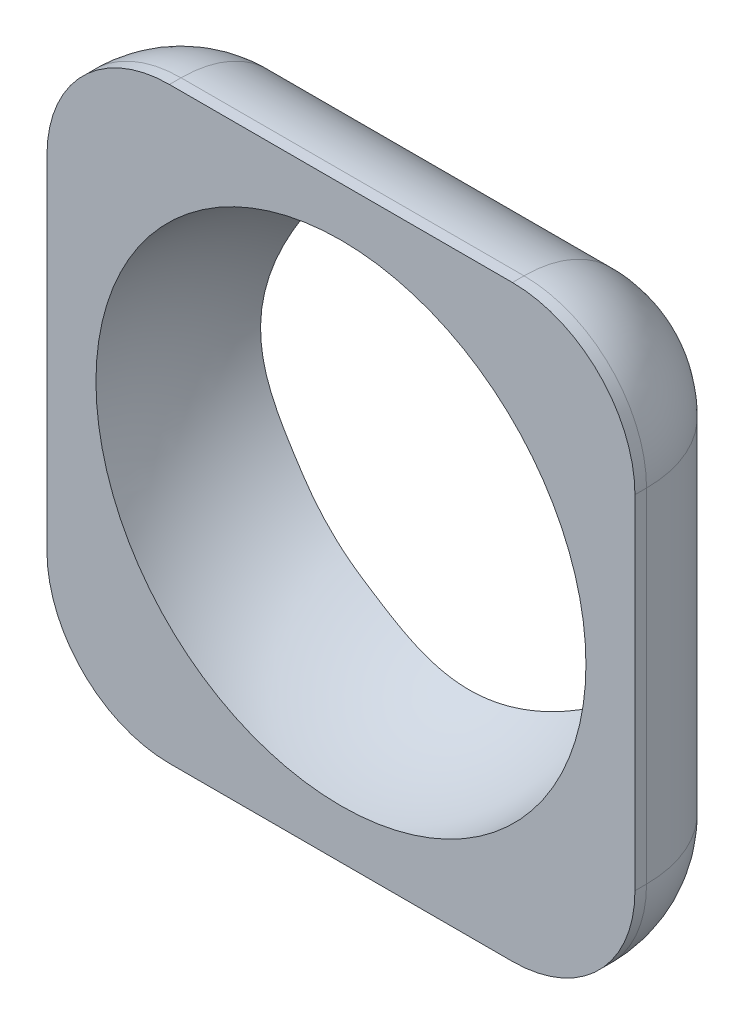
ISO-10303-21;
HEADER;
FILE_DESCRIPTION(('STEP AP214'),'2;1');
FILE_NAME('part.step','',(''),(''),'','','');
FILE_SCHEMA(('AUTOMOTIVE_DESIGN { 1 0 10303 214 1 1 1 1 }'));
ENDSEC;
DATA;
#1=APPLICATION_CONTEXT('core data for automotive mechanical design processes');
#2=APPLICATION_PROTOCOL_DEFINITION('international standard','automotive_design',2000,#1);
#3=PRODUCT_CONTEXT('',#1,'mechanical');
#4=PRODUCT('Part','Part','',(#3));
#5=PRODUCT_RELATED_PRODUCT_CATEGORY('part','',(#4));
#6=PRODUCT_DEFINITION_FORMATION('','',#4);
#7=PRODUCT_DEFINITION_CONTEXT('part definition',#1,'design');
#8=PRODUCT_DEFINITION('design','',#6,#7);
#9=PRODUCT_DEFINITION_SHAPE('','',#8);
#10=(LENGTH_UNIT() NAMED_UNIT(*) SI_UNIT(.MILLI.,.METRE.));
#11=(NAMED_UNIT(*) PLANE_ANGLE_UNIT() SI_UNIT($,.RADIAN.));
#12=(NAMED_UNIT(*) SI_UNIT($,.STERADIAN.) SOLID_ANGLE_UNIT());
#13=UNCERTAINTY_MEASURE_WITH_UNIT(LENGTH_MEASURE(1.E-05),#10,'distance_accuracy_value','');
#14=(GEOMETRIC_REPRESENTATION_CONTEXT(3) GLOBAL_UNCERTAINTY_ASSIGNED_CONTEXT((#13)) GLOBAL_UNIT_ASSIGNED_CONTEXT((#10,
#11,#12)) REPRESENTATION_CONTEXT('',''));
#15=CARTESIAN_POINT('',(0.,0.,0.));
#16=DIRECTION('',(0.,0.,1.));
#17=DIRECTION('',(1.,0.,0.));
#18=AXIS2_PLACEMENT_3D('',#15,#16,#17);
#19=CARTESIAN_POINT('',(0.,24.,5.02661661329301));
#20=DIRECTION('',(0.,0.,1.));
#21=DIRECTION('',(1.,0.,0.));
#22=AXIS2_PLACEMENT_3D('',#19,#20,#21);
#23=PLANE('',#22);
#24=DIRECTION('',(0.,-1.,0.));
#25=VECTOR('',#24,1.);
#26=CARTESIAN_POINT('',(19.,24.,5.02661661329301));
#27=LINE('',#26,#25);
#28=CARTESIAN_POINT('',(19.,7.41283591942474,5.02661661329301));
#29=VERTEX_POINT('',#28);
#30=CARTESIAN_POINT('',(19.,5.,5.02661661329301));
#31=VERTEX_POINT('',#30);
#32=EDGE_CURVE('E172',#29,#31,#27,.T.);
#33=ORIENTED_EDGE('',*,*,#32,.T.);
#34=DIRECTION('',(1.,0.,0.));
#35=VECTOR('',#34,1.);
#36=CARTESIAN_POINT('',(0.,5.,5.02661661329301));
#37=LINE('',#36,#35);
#38=CARTESIAN_POINT('',(16.5871640805753,5.,5.02661661329301));
#39=VERTEX_POINT('',#38);
#40=EDGE_CURVE('E174',#31,#39,#37,.F.);
#41=ORIENTED_EDGE('',*,*,#40,.T.);
#42=CARTESIAN_POINT('',(12.,12.,5.02661661329301));
#43=DIRECTION('',(0.,0.,1.));
#44=DIRECTION('',(1.,0.,0.));
#45=AXIS2_PLACEMENT_3D('',#42,#43,#44);
#46=CIRCLE('',#45,8.36911430810452);
#47=EDGE_CURVE('E262',#29,#39,#46,.F.);
#48=ORIENTED_EDGE('',*,*,#47,.F.);
#49=EDGE_LOOP('',(#33,#41,#48));
#50=FACE_BOUND('',#49,.T.);
#51=ADVANCED_FACE('F32',(#50),#23,.F.);
#52=DIRECTION('',(1.,0.,0.));
#53=VECTOR('',#52,1.);
#54=CARTESIAN_POINT('',(0.,19.,5.02661661329301));
#55=LINE('',#54,#53);
#56=CARTESIAN_POINT('',(16.5871640805753,19.,5.02661661329301));
#57=VERTEX_POINT('',#56);
#58=CARTESIAN_POINT('',(19.,19.,5.02661661329301));
#59=VERTEX_POINT('',#58);
#60=EDGE_CURVE('E168',#57,#59,#55,.T.);
#61=ORIENTED_EDGE('',*,*,#60,.T.);
#62=DIRECTION('',(0.,-1.,0.));
#63=VECTOR('',#62,1.);
#64=CARTESIAN_POINT('',(19.,24.,5.02661661329301));
#65=LINE('',#64,#63);
#66=CARTESIAN_POINT('',(19.,16.5871640805753,5.02661661329301));
#67=VERTEX_POINT('',#66);
#68=EDGE_CURVE('E170',#59,#67,#65,.T.);
#69=ORIENTED_EDGE('',*,*,#68,.T.);
#70=EDGE_CURVE('E302',#57,#67,#46,.F.);
#71=ORIENTED_EDGE('',*,*,#70,.F.);
#72=EDGE_LOOP('',(#61,#69,#71));
#73=FACE_BOUND('',#72,.T.);
#74=ADVANCED_FACE('F235',(#73),#23,.F.);
#75=CARTESIAN_POINT('',(7.41283591942474,5.,5.02661661329301));
#76=VERTEX_POINT('',#75);
#77=CARTESIAN_POINT('',(5.,7.41283591942474,5.02661661329301));
#78=VERTEX_POINT('',#77);
#79=EDGE_CURVE('E258',#76,#78,#46,.F.);
#80=ORIENTED_EDGE('',*,*,#79,.F.);
#81=DIRECTION('',(1.,0.,0.));
#82=VECTOR('',#81,1.);
#83=CARTESIAN_POINT('',(0.,5.,5.02661661329301));
#84=LINE('',#83,#82);
#85=CARTESIAN_POINT('',(5.,5.,5.02661661329301));
#86=VERTEX_POINT('',#85);
#87=EDGE_CURVE('E166',#76,#86,#84,.F.);
#88=ORIENTED_EDGE('',*,*,#87,.T.);
#89=DIRECTION('',(0.,-1.,0.));
#90=VECTOR('',#89,1.);
#91=CARTESIAN_POINT('',(5.,24.,5.02661661329301));
#92=LINE('',#91,#90);
#93=EDGE_CURVE('E164',#86,#78,#92,.F.);
#94=ORIENTED_EDGE('',*,*,#93,.T.);
#95=EDGE_LOOP('',(#80,#88,#94));
#96=FACE_BOUND('',#95,.T.);
#97=ADVANCED_FACE('F240',(#96),#23,.F.);
#98=CARTESIAN_POINT('',(0.,0.,10.5));
#99=DIRECTION('',(1.,0.,0.));
#100=DIRECTION('',(0.,0.,-1.));
#101=AXIS2_PLACEMENT_3D('',#98,#99,#100);
#102=PLANE('',#101);
#103=DIRECTION('',(0.,-1.,0.));
#104=VECTOR('',#103,1.);
#105=CARTESIAN_POINT('',(0.,0.,10.026616613293));
#106=LINE('',#105,#104);
#107=CARTESIAN_POINT('',(0.,19.,10.026616613293));
#108=VERTEX_POINT('',#107);
#109=CARTESIAN_POINT('',(0.,5.,10.026616613293));
#110=VERTEX_POINT('',#109);
#111=EDGE_CURVE('E49',#108,#110,#106,.T.);
#112=ORIENTED_EDGE('',*,*,#111,.T.);
#113=DIRECTION('',(0.,0.,-1.));
#114=VECTOR('',#113,1.);
#115=CARTESIAN_POINT('',(0.,5.,10.5));
#116=LINE('',#115,#114);
#117=CARTESIAN_POINT('',(0.,5.,10.5));
#118=VERTEX_POINT('',#117);
#119=EDGE_CURVE('E336',#110,#118,#116,.F.);
#120=ORIENTED_EDGE('',*,*,#119,.T.);
#121=DIRECTION('',(0.,-1.,0.));
#122=VECTOR('',#121,1.);
#123=CARTESIAN_POINT('',(0.,0.,10.5));
#124=LINE('',#123,#122);
#125=CARTESIAN_POINT('',(0.,19.,10.5));
#126=VERTEX_POINT('',#125);
#127=EDGE_CURVE('E139',#126,#118,#124,.T.);
#128=ORIENTED_EDGE('',*,*,#127,.F.);
#129=DIRECTION('',(0.,0.,-1.));
#130=VECTOR('',#129,1.);
#131=CARTESIAN_POINT('',(0.,19.,10.5));
#132=LINE('',#131,#130);
#133=EDGE_CURVE('E54',#126,#108,#132,.T.);
#134=ORIENTED_EDGE('',*,*,#133,.T.);
#135=EDGE_LOOP('',(#112,#120,#128,#134));
#136=FACE_BOUND('',#135,.T.);
#137=ADVANCED_FACE('F250',(#136),#102,.F.);
#138=CARTESIAN_POINT('',(0.,0.,10.5));
#139=DIRECTION('',(0.,1.,0.));
#140=DIRECTION('',(0.,0.,1.));
#141=AXIS2_PLACEMENT_3D('',#138,#139,#140);
#142=PLANE('',#141);
#143=DIRECTION('',(1.,0.,0.));
#144=VECTOR('',#143,1.);
#145=CARTESIAN_POINT('',(0.,0.,10.5));
#146=LINE('',#145,#144);
#147=CARTESIAN_POINT('',(5.,0.,10.5));
#148=VERTEX_POINT('',#147);
#149=CARTESIAN_POINT('',(19.,0.,10.5));
#150=VERTEX_POINT('',#149);
#151=EDGE_CURVE('E137',#148,#150,#146,.T.);
#152=ORIENTED_EDGE('',*,*,#151,.F.);
#153=DIRECTION('',(0.,0.,-1.));
#154=VECTOR('',#153,1.);
#155=CARTESIAN_POINT('',(5.,0.,10.5));
#156=LINE('',#155,#154);
#157=CARTESIAN_POINT('',(5.,0.,10.026616613293));
#158=VERTEX_POINT('',#157);
#159=EDGE_CURVE('E145',#148,#158,#156,.T.);
#160=ORIENTED_EDGE('',*,*,#159,.T.);
#161=DIRECTION('',(1.,0.,0.));
#162=VECTOR('',#161,1.);
#163=CARTESIAN_POINT('',(0.,0.,10.026616613293));
#164=LINE('',#163,#162);
#165=CARTESIAN_POINT('',(19.,0.,10.026616613293));
#166=VERTEX_POINT('',#165);
#167=EDGE_CURVE('E156',#158,#166,#164,.T.);
#168=ORIENTED_EDGE('',*,*,#167,.T.);
#169=DIRECTION('',(0.,0.,-1.));
#170=VECTOR('',#169,1.);
#171=CARTESIAN_POINT('',(19.,0.,10.5));
#172=LINE('',#171,#170);
#173=EDGE_CURVE('E148',#166,#150,#172,.F.);
#174=ORIENTED_EDGE('',*,*,#173,.T.);
#175=EDGE_LOOP('',(#152,#160,#168,#174));
#176=FACE_BOUND('',#175,.T.);
#177=ADVANCED_FACE('F143',(#176),#142,.F.);
#178=CARTESIAN_POINT('',(24.,0.,10.5));
#179=DIRECTION('',(-1.,0.,0.));
#180=DIRECTION('',(0.,0.,1.));
#181=AXIS2_PLACEMENT_3D('',#178,#179,#180);
#182=PLANE('',#181);
#183=DIRECTION('',(0.,-1.,0.));
#184=VECTOR('',#183,1.);
#185=CARTESIAN_POINT('',(24.,0.,10.026616613293));
#186=LINE('',#185,#184);
#187=CARTESIAN_POINT('',(24.,5.,10.026616613293));
#188=VERTEX_POINT('',#187);
#189=CARTESIAN_POINT('',(24.,19.,10.026616613293));
#190=VERTEX_POINT('',#189);
#191=EDGE_CURVE('E348',#188,#190,#186,.F.);
#192=ORIENTED_EDGE('',*,*,#191,.T.);
#193=DIRECTION('',(0.,0.,-1.));
#194=VECTOR('',#193,1.);
#195=CARTESIAN_POINT('',(24.,19.,10.5));
#196=LINE('',#195,#194);
#197=CARTESIAN_POINT('',(24.,19.,10.5));
#198=VERTEX_POINT('',#197);
#199=EDGE_CURVE('E332',#190,#198,#196,.F.);
#200=ORIENTED_EDGE('',*,*,#199,.T.);
#201=DIRECTION('',(0.,1.,0.));
#202=VECTOR('',#201,1.);
#203=CARTESIAN_POINT('',(24.,0.,10.5));
#204=LINE('',#203,#202);
#205=CARTESIAN_POINT('',(24.,5.,10.5));
#206=VERTEX_POINT('',#205);
#207=EDGE_CURVE('E149',#206,#198,#204,.T.);
#208=ORIENTED_EDGE('',*,*,#207,.F.);
#209=DIRECTION('',(0.,0.,-1.));
#210=VECTOR('',#209,1.);
#211=CARTESIAN_POINT('',(24.,5.,10.5));
#212=LINE('',#211,#210);
#213=EDGE_CURVE('E349',#206,#188,#212,.T.);
#214=ORIENTED_EDGE('',*,*,#213,.T.);
#215=EDGE_LOOP('',(#192,#200,#208,#214));
#216=FACE_BOUND('',#215,.T.);
#217=ADVANCED_FACE('F352',(#216),#182,.F.);
#218=CARTESIAN_POINT('',(0.,24.,10.5));
#219=DIRECTION('',(0.,-1.,0.));
#220=DIRECTION('',(0.,0.,-1.));
#221=AXIS2_PLACEMENT_3D('',#218,#219,#220);
#222=PLANE('',#221);
#223=DIRECTION('',(1.,0.,0.));
#224=VECTOR('',#223,1.);
#225=CARTESIAN_POINT('',(0.,24.,10.026616613293));
#226=LINE('',#225,#224);
#227=CARTESIAN_POINT('',(19.,24.,10.026616613293));
#228=VERTEX_POINT('',#227);
#229=CARTESIAN_POINT('',(5.,24.,10.026616613293));
#230=VERTEX_POINT('',#229);
#231=EDGE_CURVE('E344',#228,#230,#226,.F.);
#232=ORIENTED_EDGE('',*,*,#231,.T.);
#233=DIRECTION('',(0.,0.,-1.));
#234=VECTOR('',#233,1.);
#235=CARTESIAN_POINT('',(5.,24.,10.5));
#236=LINE('',#235,#234);
#237=CARTESIAN_POINT('',(5.,24.,10.5));
#238=VERTEX_POINT('',#237);
#239=EDGE_CURVE('E342',#230,#238,#236,.F.);
#240=ORIENTED_EDGE('',*,*,#239,.T.);
#241=DIRECTION('',(-1.,0.,0.));
#242=VECTOR('',#241,1.);
#243=CARTESIAN_POINT('',(0.,24.,10.5));
#244=LINE('',#243,#242);
#245=CARTESIAN_POINT('',(19.,24.,10.5));
#246=VERTEX_POINT('',#245);
#247=EDGE_CURVE('E317',#246,#238,#244,.T.);
#248=ORIENTED_EDGE('',*,*,#247,.F.);
#249=DIRECTION('',(0.,0.,-1.));
#250=VECTOR('',#249,1.);
#251=CARTESIAN_POINT('',(19.,24.,10.5));
#252=LINE('',#251,#250);
#253=EDGE_CURVE('E333',#246,#228,#252,.T.);
#254=ORIENTED_EDGE('',*,*,#253,.T.);
#255=EDGE_LOOP('',(#232,#240,#248,#254));
#256=FACE_BOUND('',#255,.T.);
#257=ADVANCED_FACE('F445',(#256),#222,.F.);
#258=CARTESIAN_POINT('',(0.,0.,10.5));
#259=DIRECTION('',(0.,0.,-1.));
#260=DIRECTION('',(-1.,0.,0.));
#261=AXIS2_PLACEMENT_3D('',#258,#259,#260);
#262=PLANE('',#261);
#263=CARTESIAN_POINT('',(12.,12.,10.5));
#264=DIRECTION('',(0.,0.,-1.));
#265=DIRECTION('',(-1.,0.,0.));
#266=AXIS2_PLACEMENT_3D('',#263,#264,#265);
#267=CIRCLE('',#266,10.);
#268=CARTESIAN_POINT('',(2.,12.,10.5));
#269=VERTEX_POINT('',#268);
#270=EDGE_CURVE('E310',#269,#269,#267,.T.);
#271=ORIENTED_EDGE('',*,*,#270,.T.);
#272=EDGE_LOOP('',(#271));
#273=FACE_BOUND('',#272,.T.);
#274=ORIENTED_EDGE('',*,*,#127,.T.);
#275=CARTESIAN_POINT('',(5.,5.,10.5));
#276=DIRECTION('',(0.,0.,-1.));
#277=DIRECTION('',(-1.,0.,0.));
#278=AXIS2_PLACEMENT_3D('',#275,#276,#277);
#279=CIRCLE('',#278,5.);
#280=EDGE_CURVE('E11',#118,#148,#279,.F.);
#281=ORIENTED_EDGE('',*,*,#280,.T.);
#282=ORIENTED_EDGE('',*,*,#151,.T.);
#283=CARTESIAN_POINT('',(19.,5.,10.5));
#284=DIRECTION('',(0.,0.,-1.));
#285=DIRECTION('',(-1.,0.,0.));
#286=AXIS2_PLACEMENT_3D('',#283,#284,#285);
#287=CIRCLE('',#286,5.);
#288=EDGE_CURVE('E325',#150,#206,#287,.F.);
#289=ORIENTED_EDGE('',*,*,#288,.T.);
#290=ORIENTED_EDGE('',*,*,#207,.T.);
#291=CARTESIAN_POINT('',(19.,19.,10.5));
#292=DIRECTION('',(0.,0.,-1.));
#293=DIRECTION('',(-1.,0.,0.));
#294=AXIS2_PLACEMENT_3D('',#291,#292,#293);
#295=CIRCLE('',#294,5.);
#296=EDGE_CURVE('E323',#198,#246,#295,.F.);
#297=ORIENTED_EDGE('',*,*,#296,.T.);
#298=ORIENTED_EDGE('',*,*,#247,.T.);
#299=CARTESIAN_POINT('',(5.,19.,10.5));
#300=DIRECTION('',(0.,0.,-1.));
#301=DIRECTION('',(-1.,0.,0.));
#302=AXIS2_PLACEMENT_3D('',#299,#300,#301);
#303=CIRCLE('',#302,5.);
#304=EDGE_CURVE('E41',#238,#126,#303,.F.);
#305=ORIENTED_EDGE('',*,*,#304,.T.);
#306=EDGE_LOOP('',(#274,#281,#282,#289,#290,#297,#298,#305));
#307=FACE_BOUND('',#306,.T.);
#308=ADVANCED_FACE('F136',(#273,#307),#262,.F.);
#309=CARTESIAN_POINT('',(12.,12.,10.5));
#310=DIRECTION('',(0.,1.,0.));
#311=DIRECTION('',(1.,0.,0.));
#312=AXIS2_PLACEMENT_3D('',#309,#310,#311);
#313=SPHERICAL_SURFACE('',#312,10.);
#314=ORIENTED_EDGE('',*,*,#47,.T.);
#315=CARTESIAN_POINT('',(16.5871640805753,5.,5.02661661329301));
#316=CARTESIAN_POINT('',(16.4759319559739,4.92711112236214,5.02661390748725));
#317=CARTESIAN_POINT('',(16.3635493857927,4.85600693119353,5.02821098195718));
#318=CARTESIAN_POINT('',(16.1364509945017,4.71772514975554,5.03411159240597));
#319=CARTESIAN_POINT('',(16.0217349816119,4.65054788400253,5.03841535171738));
#320=CARTESIAN_POINT('',(15.6735814601982,4.45518813466032,5.05466905318735));
#321=CARTESIAN_POINT('',(15.4366034109512,4.33348558382401,5.06995732380388));
#322=CARTESIAN_POINT('',(14.951114390107,4.10950386642152,5.10523360330301));
#323=CARTESIAN_POINT('',(14.7025129009047,4.00742754379127,5.12526636398971));
#324=CARTESIAN_POINT('',(14.1967578487881,3.82777041761229,5.16509678890495));
#325=CARTESIAN_POINT('',(13.9396142542782,3.75016209875609,5.18489469294438));
#326=CARTESIAN_POINT('',(13.4929133636884,3.64100623906436,5.21461598059269));
#327=CARTESIAN_POINT('',(13.3050947952575,3.60263264526717,5.22574344476754));
#328=CARTESIAN_POINT('',(12.9267635287629,3.54108367512069,5.2440851908175));
#329=CARTESIAN_POINT('',(12.7362509640542,3.51790754915635,5.25129966569777));
#330=CARTESIAN_POINT('',(12.3550435980266,3.48758224610107,5.26081682380272));
#331=CARTESIAN_POINT('',(12.1643576916491,3.48033189554758,5.26315050920503));
#332=CARTESIAN_POINT('',(11.7830551744815,3.481796051516,5.26268362896315));
#333=CARTESIAN_POINT('',(11.5924385629369,3.49051037868273,5.25988312099907));
#334=CARTESIAN_POINT('',(11.2130417368365,3.52358882152634,5.24953554137967));
#335=CARTESIAN_POINT('',(11.0242589558764,3.54792636788646,5.24199652862198));
#336=CARTESIAN_POINT('',(10.6494175252864,3.61148351856609,5.2231687059465));
#337=CARTESIAN_POINT('',(10.4633590881666,3.6507042774822,5.21187960511618));
#338=CARTESIAN_POINT('',(10.0939035785086,3.74321811805314,5.18690596772776));
#339=CARTESIAN_POINT('',(9.91052614782308,3.79658559305593,5.17320890055599));
#340=CARTESIAN_POINT('',(9.54802363564173,3.91607431414918,5.14513473731846));
#341=CARTESIAN_POINT('',(9.36889917818054,3.98219741903096,5.13075754237305));
#342=CARTESIAN_POINT('',(9.03574523580641,4.11759891453808,5.1046705123011));
#343=CARTESIAN_POINT('',(8.88121206992217,4.18562487284244,5.09284460294664));
#344=CARTESIAN_POINT('',(8.57584938225083,4.32980089119102,5.07120062164614));
#345=CARTESIAN_POINT('',(8.42501976236347,4.40595073576192,5.06138249646691));
#346=CARTESIAN_POINT('',(8.12849675640205,4.56480839728199,5.04495855473015));
#347=CARTESIAN_POINT('',(7.98276857367817,4.64744838191876,5.03832361528219));
#348=CARTESIAN_POINT('',(7.69502244124607,4.81911968065517,5.0291472287363));
#349=CARTESIAN_POINT('',(7.55300395397167,4.90815006164588,5.02660518526943));
#350=CARTESIAN_POINT('',(7.41283591942476,5.00000000000003,5.02661661329295));
#351=B_SPLINE_CURVE_WITH_KNOTS('',3,(#315,#316,#317,#318,#319,#320,#321,#322,#323,#324,#325,
#326,#327,#328,#329,#330,#331,#332,#333,#334,#335,#336,#337,#338,#339,#340,#341,#342,#343,#344,
#345,#346,#347,#348,#349,#350),.UNSPECIFIED.,.F.,.F.,(4,2,2,2,2,2,2,2,2,2,2,2,2,2,2,2,2,4),(0.,
0.398900804041361,0.797834526295304,1.59737011265033,2.40477070735553,3.21126008029337,
3.78673801177319,4.36218755567002,4.93397067342031,5.50574736751211,6.07655424776015,
6.64740541861135,7.22132021947016,7.79531871629817,8.30283690033737,8.81034162659935,
9.31311020988316,9.81580552897722),.UNSPECIFIED.);
#352=EDGE_CURVE('E211',#39,#76,#351,.T.);
#353=ORIENTED_EDGE('',*,*,#352,.T.);
#354=ORIENTED_EDGE('',*,*,#79,.T.);
#355=CARTESIAN_POINT('',(5.,7.41283591942474,5.02661661329301));
#356=CARTESIAN_POINT('',(4.92711112236214,7.52406804402605,5.02661390748725));
#357=CARTESIAN_POINT('',(4.85600693119353,7.63645061420726,5.02821098195718));
#358=CARTESIAN_POINT('',(4.71772514975554,7.86354900549834,5.03411159240597));
#359=CARTESIAN_POINT('',(4.65054788400253,7.97826501838813,5.03841535171738));
#360=CARTESIAN_POINT('',(4.45518813466032,8.32641853980178,5.05466905318735));
#361=CARTESIAN_POINT('',(4.33348558382401,8.56339658904877,5.06995732380388));
#362=CARTESIAN_POINT('',(4.10950386642152,9.04888560989304,5.10523360330301));
#363=CARTESIAN_POINT('',(4.00742754379126,9.29748709909525,5.12526636398971));
#364=CARTESIAN_POINT('',(3.82777041761228,9.80324215121191,5.16509678890495));
#365=CARTESIAN_POINT('',(3.75016209875609,10.0603857457218,5.18489469294438));
#366=CARTESIAN_POINT('',(3.64100623906436,10.5070866363116,5.21461598059269));
#367=CARTESIAN_POINT('',(3.60263264526717,10.6949052047425,5.22574344476754));
#368=CARTESIAN_POINT('',(3.54108367512069,11.0732364712371,5.24408519081751));
#369=CARTESIAN_POINT('',(3.51790754915635,11.2637490359458,5.25129966569777));
#370=CARTESIAN_POINT('',(3.48758224610106,11.6449564019734,5.26081682380272));
#371=CARTESIAN_POINT('',(3.48033189554758,11.8356423083509,5.26315050920503));
#372=CARTESIAN_POINT('',(3.481796051516,12.2169448255185,5.26268362896315));
#373=CARTESIAN_POINT('',(3.49051037868273,12.407561437063,5.25988312099907));
#374=CARTESIAN_POINT('',(3.52358882152634,12.7869582631634,5.24953554137967));
#375=CARTESIAN_POINT('',(3.54792636788646,12.9757410441236,5.24199652862198));
#376=CARTESIAN_POINT('',(3.61148351856609,13.3505824747136,5.2231687059465));
#377=CARTESIAN_POINT('',(3.6507042774822,13.5366409118334,5.21187960511618));
#378=CARTESIAN_POINT('',(3.74321811805313,13.9060964214914,5.18690596772776));
#379=CARTESIAN_POINT('',(3.79658559305592,14.0894738521769,5.17320890055599));
#380=CARTESIAN_POINT('',(3.91607431414918,14.4519763643583,5.14513473731846));
#381=CARTESIAN_POINT('',(3.98219741903095,14.6311008218194,5.13075754237305));
#382=CARTESIAN_POINT('',(4.11759891453807,14.9642547641936,5.1046705123011));
#383=CARTESIAN_POINT('',(4.18562487284244,15.1187879300778,5.09284460294664));
#384=CARTESIAN_POINT('',(4.32980089119102,15.4241506177492,5.07120062164614));
#385=CARTESIAN_POINT('',(4.40595073576191,15.5749802376365,5.06138249646691));
#386=CARTESIAN_POINT('',(4.56480839728199,15.8715032435979,5.04495855473015));
#387=CARTESIAN_POINT('',(4.64744838191876,16.0172314263218,5.03832361528219));
#388=CARTESIAN_POINT('',(4.81911968065517,16.3049775587539,5.0291472287363));
#389=CARTESIAN_POINT('',(4.90815006164588,16.4469960460283,5.02660518526943));
#390=CARTESIAN_POINT('',(5.00000000000003,16.5871640805752,5.02661661329295));
#391=B_SPLINE_CURVE_WITH_KNOTS('',3,(#355,#356,#357,#358,#359,#360,#361,#362,#363,#364,#365,
#366,#367,#368,#369,#370,#371,#372,#373,#374,#375,#376,#377,#378,#379,#380,#381,#382,#383,#384,
#385,#386,#387,#388,#389,#390),.UNSPECIFIED.,.F.,.F.,(4,2,2,2,2,2,2,2,2,2,2,2,2,2,2,2,2,4),(0.,
0.398900804041363,0.797834526295306,1.59737011265033,2.40477070735553,3.21126008029338,
3.78673801177319,4.36218755567002,4.93397067342031,5.50574736751211,6.07655424776015,
6.64740541861135,7.22132021947015,7.79531871629816,8.30283690033737,8.81034162659935,
9.31311020988317,9.81580552897723),.UNSPECIFIED.);
#392=CARTESIAN_POINT('',(5.,16.5871640805753,5.02661661329301));
#393=VERTEX_POINT('',#392);
#394=EDGE_CURVE('E177',#78,#393,#391,.T.);
#395=ORIENTED_EDGE('',*,*,#394,.T.);
#396=CARTESIAN_POINT('',(7.41283591942474,19.,5.02661661329301));
#397=VERTEX_POINT('',#396);
#398=EDGE_CURVE('E263',#393,#397,#46,.F.);
#399=ORIENTED_EDGE('',*,*,#398,.T.);
#400=CARTESIAN_POINT('',(7.41283591942474,19.,5.02661661329301));
#401=CARTESIAN_POINT('',(7.52406804402605,19.0728888776379,5.02661390748725));
#402=CARTESIAN_POINT('',(7.63645061420727,19.1439930688065,5.02821098195718));
#403=CARTESIAN_POINT('',(7.86354900549835,19.2822748502445,5.03411159240597));
#404=CARTESIAN_POINT('',(7.97826501838814,19.3494521159975,5.03841535171738));
#405=CARTESIAN_POINT('',(8.32641853980178,19.5448118653397,5.05466905318735));
#406=CARTESIAN_POINT('',(8.56339658904877,19.666514416176,5.06995732380388));
#407=CARTESIAN_POINT('',(9.04888560989305,19.8904961335785,5.10523360330301));
#408=CARTESIAN_POINT('',(9.29748709909526,19.9925724562087,5.12526636398971));
#409=CARTESIAN_POINT('',(9.80324215121192,20.1722295823877,5.16509678890495));
#410=CARTESIAN_POINT('',(10.0603857457218,20.2498379012439,5.18489469294438));
#411=CARTESIAN_POINT('',(10.5070866363116,20.3589937609356,5.21461598059269));
#412=CARTESIAN_POINT('',(10.6949052047425,20.3973673547328,5.22574344476754));
#413=CARTESIAN_POINT('',(11.0732364712371,20.4589163248793,5.2440851908175));
#414=CARTESIAN_POINT('',(11.2637490359458,20.4820924508436,5.25129966569777));
#415=CARTESIAN_POINT('',(11.6449564019734,20.5124177538989,5.26081682380272));
#416=CARTESIAN_POINT('',(11.8356423083509,20.5196681044524,5.26315050920503));
#417=CARTESIAN_POINT('',(12.2169448255185,20.518203948484,5.26268362896315));
#418=CARTESIAN_POINT('',(12.407561437063,20.5094896213173,5.25988312099907));
#419=CARTESIAN_POINT('',(12.7869582631635,20.4764111784737,5.24953554137967));
#420=CARTESIAN_POINT('',(12.9757410441236,20.4520736321135,5.24199652862198));
#421=CARTESIAN_POINT('',(13.3505824747136,20.3885164814339,5.2231687059465));
#422=CARTESIAN_POINT('',(13.5366409118334,20.3492957225178,5.21187960511618));
#423=CARTESIAN_POINT('',(13.9060964214914,20.2567818819469,5.18690596772776));
#424=CARTESIAN_POINT('',(14.0894738521769,20.2034144069441,5.17320890055599));
#425=CARTESIAN_POINT('',(14.4519763643583,20.0839256858508,5.14513473731846));
#426=CARTESIAN_POINT('',(14.6311008218195,20.017802580969,5.13075754237304));
#427=CARTESIAN_POINT('',(14.9642547641936,19.8824010854619,5.1046705123011));
#428=CARTESIAN_POINT('',(15.1187879300778,19.8143751271576,5.09284460294664));
#429=CARTESIAN_POINT('',(15.4241506177492,19.670199108809,5.07120062164614));
#430=CARTESIAN_POINT('',(15.5749802376365,19.5940492642381,5.06138249646691));
#431=CARTESIAN_POINT('',(15.8715032435979,19.435191602718,5.04495855473015));
#432=CARTESIAN_POINT('',(16.0172314263218,19.3525516180812,5.03832361528219));
#433=CARTESIAN_POINT('',(16.3049775587539,19.1808803193448,5.0291472287363));
#434=CARTESIAN_POINT('',(16.4469960460283,19.0918499383541,5.02660518526943));
#435=CARTESIAN_POINT('',(16.5871640805752,19.,5.02661661329295));
#436=B_SPLINE_CURVE_WITH_KNOTS('',3,(#400,#401,#402,#403,#404,#405,#406,#407,#408,#409,#410,
#411,#412,#413,#414,#415,#416,#417,#418,#419,#420,#421,#422,#423,#424,#425,#426,#427,#428,#429,
#430,#431,#432,#433,#434,#435),.UNSPECIFIED.,.F.,.F.,(4,2,2,2,2,2,2,2,2,2,2,2,2,2,2,2,2,4),(0.,
0.398900804041366,0.797834526295308,1.59737011265033,2.40477070735553,3.21126008029337,
3.78673801177319,4.36218755567002,4.93397067342032,5.50574736751211,6.07655424776015,
6.64740541861135,7.22132021947016,7.79531871629817,8.30283690033738,8.81034162659935,
9.31311020988316,9.81580552897722),.UNSPECIFIED.);
#437=EDGE_CURVE('E184',#397,#57,#436,.T.);
#438=ORIENTED_EDGE('',*,*,#437,.T.);
#439=ORIENTED_EDGE('',*,*,#70,.T.);
#440=CARTESIAN_POINT('',(19.,16.5871640805753,5.02661661329301));
#441=CARTESIAN_POINT('',(19.0728888776379,16.475931955974,5.02661390748725));
#442=CARTESIAN_POINT('',(19.1439930688065,16.3635493857927,5.02821098195718));
#443=CARTESIAN_POINT('',(19.2822748502445,16.1364509945017,5.03411159240597));
#444=CARTESIAN_POINT('',(19.3494521159975,16.0217349816119,5.03841535171738));
#445=CARTESIAN_POINT('',(19.5448118653397,15.6735814601982,5.05466905318735));
#446=CARTESIAN_POINT('',(19.666514416176,15.4366034109512,5.06995732380388));
#447=CARTESIAN_POINT('',(19.8904961335785,14.951114390107,5.10523360330301));
#448=CARTESIAN_POINT('',(19.9925724562087,14.7025129009047,5.12526636398971));
#449=CARTESIAN_POINT('',(20.1722295823877,14.1967578487881,5.16509678890495));
#450=CARTESIAN_POINT('',(20.2498379012439,13.9396142542782,5.18489469294438));
#451=CARTESIAN_POINT('',(20.3589937609356,13.4929133636884,5.21461598059269));
#452=CARTESIAN_POINT('',(20.3973673547328,13.3050947952575,5.22574344476754));
#453=CARTESIAN_POINT('',(20.4589163248793,12.9267635287629,5.24408519081751));
#454=CARTESIAN_POINT('',(20.4820924508436,12.7362509640542,5.25129966569777));
#455=CARTESIAN_POINT('',(20.5124177538989,12.3550435980266,5.26081682380272));
#456=CARTESIAN_POINT('',(20.5196681044524,12.1643576916491,5.26315050920503));
#457=CARTESIAN_POINT('',(20.518203948484,11.7830551744815,5.26268362896315));
#458=CARTESIAN_POINT('',(20.5094896213173,11.592438562937,5.25988312099908));
#459=CARTESIAN_POINT('',(20.4764111784737,11.2130417368366,5.24953554137967));
#460=CARTESIAN_POINT('',(20.4520736321135,11.0242589558764,5.24199652862198));
#461=CARTESIAN_POINT('',(20.3885164814339,10.6494175252864,5.2231687059465));
#462=CARTESIAN_POINT('',(20.3492957225178,10.4633590881666,5.21187960511618));
#463=CARTESIAN_POINT('',(20.2567818819469,10.0939035785086,5.18690596772776));
#464=CARTESIAN_POINT('',(20.2034144069441,9.9105261478231,5.17320890055599));
#465=CARTESIAN_POINT('',(20.0839256858508,9.54802363564175,5.14513473731846));
#466=CARTESIAN_POINT('',(20.017802580969,9.36889917818057,5.13075754237305));
#467=CARTESIAN_POINT('',(19.8824010854619,9.03574523580643,5.1046705123011));
#468=CARTESIAN_POINT('',(19.8143751271576,8.88121206992218,5.09284460294665));
#469=CARTESIAN_POINT('',(19.670199108809,8.57584938225084,5.07120062164614));
#470=CARTESIAN_POINT('',(19.5940492642381,8.42501976236348,5.06138249646691));
#471=CARTESIAN_POINT('',(19.435191602718,8.12849675640206,5.04495855473015));
#472=CARTESIAN_POINT('',(19.3525516180812,7.98276857367817,5.03832361528219));
#473=CARTESIAN_POINT('',(19.1808803193448,7.69502244124607,5.0291472287363));
#474=CARTESIAN_POINT('',(19.0918499383541,7.55300395397167,5.02660518526943));
#475=CARTESIAN_POINT('',(19.,7.41283591942475,5.02661661329295));
#476=B_SPLINE_CURVE_WITH_KNOTS('',3,(#440,#441,#442,#443,#444,#445,#446,#447,#448,#449,#450,
#451,#452,#453,#454,#455,#456,#457,#458,#459,#460,#461,#462,#463,#464,#465,#466,#467,#468,#469,
#470,#471,#472,#473,#474,#475),.UNSPECIFIED.,.F.,.F.,(4,2,2,2,2,2,2,2,2,2,2,2,2,2,2,2,2,4),(0.,
0.398900804041361,0.797834526295306,1.59737011265033,2.40477070735553,3.21126008029337,
3.78673801177319,4.36218755567001,4.93397067342031,5.5057473675121,6.07655424776014,
6.64740541861134,7.22132021947015,7.79531871629815,8.30283690033737,8.81034162659935,
9.31311020988317,9.81580552897724),.UNSPECIFIED.);
#477=EDGE_CURVE('E206',#67,#29,#476,.T.);
#478=ORIENTED_EDGE('',*,*,#477,.T.);
#479=EDGE_LOOP('',(#314,#353,#354,#395,#399,#438,#439,#478));
#480=FACE_BOUND('',#479,.T.);
#481=ORIENTED_EDGE('',*,*,#270,.F.);
#482=EDGE_LOOP('',(#481));
#483=FACE_BOUND('',#482,.T.);
#484=ADVANCED_FACE('F194',(#480,#483),#313,.F.);
#485=DIRECTION('',(0.,-1.,0.));
#486=VECTOR('',#485,1.);
#487=CARTESIAN_POINT('',(5.,24.,5.02661661329301));
#488=LINE('',#487,#486);
#489=CARTESIAN_POINT('',(5.,19.,5.02661661329301));
#490=VERTEX_POINT('',#489);
#491=EDGE_CURVE('E155',#393,#490,#488,.F.);
#492=ORIENTED_EDGE('',*,*,#491,.T.);
#493=DIRECTION('',(1.,0.,0.));
#494=VECTOR('',#493,1.);
#495=CARTESIAN_POINT('',(0.,19.,5.02661661329301));
#496=LINE('',#495,#494);
#497=EDGE_CURVE('E158',#490,#397,#496,.T.);
#498=ORIENTED_EDGE('',*,*,#497,.T.);
#499=ORIENTED_EDGE('',*,*,#398,.F.);
#500=EDGE_LOOP('',(#492,#498,#499));
#501=FACE_BOUND('',#500,.T.);
#502=ADVANCED_FACE('F199',(#501),#23,.F.);
#503=CARTESIAN_POINT('',(5.,19.,10.5));
#504=DIRECTION('',(0.,0.,-1.));
#505=DIRECTION('',(-1.,0.,0.));
#506=AXIS2_PLACEMENT_3D('',#503,#504,#505);
#507=CYLINDRICAL_SURFACE('',#506,5.);
#508=ORIENTED_EDGE('',*,*,#304,.F.);
#509=ORIENTED_EDGE('',*,*,#239,.F.);
#510=CARTESIAN_POINT('',(5.,19.,10.026616613293));
#511=DIRECTION('',(0.,0.,-1.));
#512=DIRECTION('',(-1.,0.,0.));
#513=AXIS2_PLACEMENT_3D('',#510,#511,#512);
#514=CIRCLE('',#513,5.);
#515=EDGE_CURVE('E297',#108,#230,#514,.T.);
#516=ORIENTED_EDGE('',*,*,#515,.F.);
#517=ORIENTED_EDGE('',*,*,#133,.F.);
#518=EDGE_LOOP('',(#508,#509,#516,#517));
#519=FACE_BOUND('',#518,.T.);
#520=ADVANCED_FACE('F34',(#519),#507,.T.);
#521=CARTESIAN_POINT('',(19.,19.,10.5));
#522=DIRECTION('',(0.,0.,-1.));
#523=DIRECTION('',(-1.,0.,0.));
#524=AXIS2_PLACEMENT_3D('',#521,#522,#523);
#525=CYLINDRICAL_SURFACE('',#524,5.);
#526=ORIENTED_EDGE('',*,*,#296,.F.);
#527=ORIENTED_EDGE('',*,*,#199,.F.);
#528=CARTESIAN_POINT('',(19.,19.,10.026616613293));
#529=DIRECTION('',(0.,0.,-1.));
#530=DIRECTION('',(-1.,0.,0.));
#531=AXIS2_PLACEMENT_3D('',#528,#529,#530);
#532=CIRCLE('',#531,5.);
#533=EDGE_CURVE('E295',#228,#190,#532,.T.);
#534=ORIENTED_EDGE('',*,*,#533,.F.);
#535=ORIENTED_EDGE('',*,*,#253,.F.);
#536=EDGE_LOOP('',(#526,#527,#534,#535));
#537=FACE_BOUND('',#536,.T.);
#538=ADVANCED_FACE('F247',(#537),#525,.T.);
#539=CARTESIAN_POINT('',(0.,19.,10.026616613293));
#540=DIRECTION('',(1.,0.,0.));
#541=DIRECTION('',(0.,0.,-1.));
#542=AXIS2_PLACEMENT_3D('',#539,#540,#541);
#543=CYLINDRICAL_SURFACE('',#542,5.);
#544=CARTESIAN_POINT('',(5.,19.,10.026616613293));
#545=DIRECTION('',(-1.,0.,0.));
#546=DIRECTION('',(0.,0.,1.));
#547=AXIS2_PLACEMENT_3D('',#544,#545,#546);
#548=CIRCLE('',#547,5.);
#549=EDGE_CURVE('E36',#230,#490,#548,.T.);
#550=ORIENTED_EDGE('',*,*,#549,.F.);
#551=ORIENTED_EDGE('',*,*,#231,.F.);
#552=CARTESIAN_POINT('',(19.,19.,10.026616613293));
#553=DIRECTION('',(1.,0.,0.));
#554=DIRECTION('',(0.,1.,0.));
#555=AXIS2_PLACEMENT_3D('',#552,#553,#554);
#556=CIRCLE('',#555,5.);
#557=EDGE_CURVE('E292',#59,#228,#556,.T.);
#558=ORIENTED_EDGE('',*,*,#557,.F.);
#559=ORIENTED_EDGE('',*,*,#60,.F.);
#560=ORIENTED_EDGE('',*,*,#437,.F.);
#561=ORIENTED_EDGE('',*,*,#497,.F.);
#562=EDGE_LOOP('',(#550,#551,#558,#559,#560,#561));
#563=FACE_BOUND('',#562,.T.);
#564=ADVANCED_FACE('F366',(#563),#543,.T.);
#565=CARTESIAN_POINT('',(5.,19.,10.026616613293));
#566=DIRECTION('',(0.,0.,1.));
#567=DIRECTION('',(1.,0.,0.));
#568=AXIS2_PLACEMENT_3D('',#565,#566,#567);
#569=SPHERICAL_SURFACE('',#568,5.);
#570=ORIENTED_EDGE('',*,*,#515,.T.);
#571=ORIENTED_EDGE('',*,*,#549,.T.);
#572=CARTESIAN_POINT('',(5.,19.,10.026616613293));
#573=DIRECTION('',(0.,1.,0.));
#574=DIRECTION('',(-1.,0.,0.));
#575=AXIS2_PLACEMENT_3D('',#572,#573,#574);
#576=CIRCLE('',#575,5.);
#577=EDGE_CURVE('E289',#108,#490,#576,.F.);
#578=ORIENTED_EDGE('',*,*,#577,.F.);
#579=EDGE_LOOP('',(#570,#571,#578));
#580=FACE_BOUND('',#579,.T.);
#581=ADVANCED_FACE('F369',(#580),#569,.T.);
#582=CARTESIAN_POINT('',(19.,19.,10.026616613293));
#583=DIRECTION('',(0.,0.,1.));
#584=DIRECTION('',(1.,0.,0.));
#585=AXIS2_PLACEMENT_3D('',#582,#583,#584);
#586=SPHERICAL_SURFACE('',#585,5.);
#587=ORIENTED_EDGE('',*,*,#557,.T.);
#588=ORIENTED_EDGE('',*,*,#533,.T.);
#589=CARTESIAN_POINT('',(19.,19.,10.026616613293));
#590=DIRECTION('',(0.,1.,0.));
#591=DIRECTION('',(0.,0.,1.));
#592=AXIS2_PLACEMENT_3D('',#589,#590,#591);
#593=CIRCLE('',#592,5.);
#594=EDGE_CURVE('E286',#59,#190,#593,.F.);
#595=ORIENTED_EDGE('',*,*,#594,.F.);
#596=EDGE_LOOP('',(#587,#588,#595));
#597=FACE_BOUND('',#596,.T.);
#598=ADVANCED_FACE('F232',(#597),#586,.T.);
#599=CARTESIAN_POINT('',(5.,0.,10.026616613293));
#600=DIRECTION('',(0.,-1.,0.));
#601=DIRECTION('',(0.,0.,-1.));
#602=AXIS2_PLACEMENT_3D('',#599,#600,#601);
#603=CYLINDRICAL_SURFACE('',#602,5.);
#604=ORIENTED_EDGE('',*,*,#394,.F.);
#605=ORIENTED_EDGE('',*,*,#93,.F.);
#606=CARTESIAN_POINT('',(5.,5.,10.026616613293));
#607=DIRECTION('',(0.,-1.,0.));
#608=DIRECTION('',(0.,0.,-1.));
#609=AXIS2_PLACEMENT_3D('',#606,#607,#608);
#610=CIRCLE('',#609,5.);
#611=EDGE_CURVE('E284',#110,#86,#610,.T.);
#612=ORIENTED_EDGE('',*,*,#611,.F.);
#613=ORIENTED_EDGE('',*,*,#111,.F.);
#614=ORIENTED_EDGE('',*,*,#577,.T.);
#615=ORIENTED_EDGE('',*,*,#491,.F.);
#616=EDGE_LOOP('',(#604,#605,#612,#613,#614,#615));
#617=FACE_BOUND('',#616,.T.);
#618=ADVANCED_FACE('F190',(#617),#603,.T.);
#619=CARTESIAN_POINT('',(5.,5.,10.5));
#620=DIRECTION('',(0.,0.,-1.));
#621=DIRECTION('',(-1.,0.,0.));
#622=AXIS2_PLACEMENT_3D('',#619,#620,#621);
#623=CYLINDRICAL_SURFACE('',#622,5.);
#624=ORIENTED_EDGE('',*,*,#280,.F.);
#625=ORIENTED_EDGE('',*,*,#119,.F.);
#626=CARTESIAN_POINT('',(5.,5.,10.026616613293));
#627=DIRECTION('',(0.,0.,-1.));
#628=DIRECTION('',(-1.,0.,0.));
#629=AXIS2_PLACEMENT_3D('',#626,#627,#628);
#630=CIRCLE('',#629,5.);
#631=EDGE_CURVE('E153',#158,#110,#630,.T.);
#632=ORIENTED_EDGE('',*,*,#631,.F.);
#633=ORIENTED_EDGE('',*,*,#159,.F.);
#634=EDGE_LOOP('',(#624,#625,#632,#633));
#635=FACE_BOUND('',#634,.T.);
#636=ADVANCED_FACE('F151',(#635),#623,.T.);
#637=CARTESIAN_POINT('',(19.,5.,10.5));
#638=DIRECTION('',(0.,0.,-1.));
#639=DIRECTION('',(-1.,0.,0.));
#640=AXIS2_PLACEMENT_3D('',#637,#638,#639);
#641=CYLINDRICAL_SURFACE('',#640,5.);
#642=ORIENTED_EDGE('',*,*,#288,.F.);
#643=ORIENTED_EDGE('',*,*,#173,.F.);
#644=CARTESIAN_POINT('',(19.,5.,10.026616613293));
#645=DIRECTION('',(0.,0.,-1.));
#646=DIRECTION('',(-1.,0.,0.));
#647=AXIS2_PLACEMENT_3D('',#644,#645,#646);
#648=CIRCLE('',#647,5.);
#649=EDGE_CURVE('E277',#188,#166,#648,.T.);
#650=ORIENTED_EDGE('',*,*,#649,.F.);
#651=ORIENTED_EDGE('',*,*,#213,.F.);
#652=EDGE_LOOP('',(#642,#643,#650,#651));
#653=FACE_BOUND('',#652,.T.);
#654=ADVANCED_FACE('F223',(#653),#641,.T.);
#655=CARTESIAN_POINT('',(19.,24.,10.026616613293));
#656=DIRECTION('',(0.,-1.,0.));
#657=DIRECTION('',(0.,0.,-1.));
#658=AXIS2_PLACEMENT_3D('',#655,#656,#657);
#659=CYLINDRICAL_SURFACE('',#658,5.);
#660=ORIENTED_EDGE('',*,*,#594,.T.);
#661=ORIENTED_EDGE('',*,*,#191,.F.);
#662=CARTESIAN_POINT('',(19.,5.,10.026616613293));
#663=DIRECTION('',(0.,-1.,0.));
#664=DIRECTION('',(1.,0.,0.));
#665=AXIS2_PLACEMENT_3D('',#662,#663,#664);
#666=CIRCLE('',#665,5.);
#667=EDGE_CURVE('E273',#31,#188,#666,.T.);
#668=ORIENTED_EDGE('',*,*,#667,.F.);
#669=ORIENTED_EDGE('',*,*,#32,.F.);
#670=ORIENTED_EDGE('',*,*,#477,.F.);
#671=ORIENTED_EDGE('',*,*,#68,.F.);
#672=EDGE_LOOP('',(#660,#661,#668,#669,#670,#671));
#673=FACE_BOUND('',#672,.T.);
#674=ADVANCED_FACE('F217',(#673),#659,.T.);
#675=CARTESIAN_POINT('',(5.,5.,10.026616613293));
#676=DIRECTION('',(0.,0.,1.));
#677=DIRECTION('',(1.,0.,0.));
#678=AXIS2_PLACEMENT_3D('',#675,#676,#677);
#679=SPHERICAL_SURFACE('',#678,5.);
#680=ORIENTED_EDGE('',*,*,#631,.T.);
#681=ORIENTED_EDGE('',*,*,#611,.T.);
#682=CARTESIAN_POINT('',(5.,5.,10.026616613293));
#683=DIRECTION('',(-1.,0.,0.));
#684=DIRECTION('',(0.,-1.,0.));
#685=AXIS2_PLACEMENT_3D('',#682,#683,#684);
#686=CIRCLE('',#685,5.);
#687=EDGE_CURVE('E270',#158,#86,#686,.F.);
#688=ORIENTED_EDGE('',*,*,#687,.F.);
#689=EDGE_LOOP('',(#680,#681,#688));
#690=FACE_BOUND('',#689,.T.);
#691=ADVANCED_FACE('F222',(#690),#679,.T.);
#692=CARTESIAN_POINT('',(19.,5.,10.026616613293));
#693=DIRECTION('',(0.,0.,1.));
#694=DIRECTION('',(1.,0.,0.));
#695=AXIS2_PLACEMENT_3D('',#692,#693,#694);
#696=SPHERICAL_SURFACE('',#695,5.);
#697=ORIENTED_EDGE('',*,*,#667,.T.);
#698=ORIENTED_EDGE('',*,*,#649,.T.);
#699=CARTESIAN_POINT('',(19.,5.,10.026616613293));
#700=DIRECTION('',(1.,0.,0.));
#701=DIRECTION('',(0.,0.,-1.));
#702=AXIS2_PLACEMENT_3D('',#699,#700,#701);
#703=CIRCLE('',#702,5.);
#704=EDGE_CURVE('E274',#31,#166,#703,.F.);
#705=ORIENTED_EDGE('',*,*,#704,.F.);
#706=EDGE_LOOP('',(#697,#698,#705));
#707=FACE_BOUND('',#706,.T.);
#708=ADVANCED_FACE('F360',(#707),#696,.T.);
#709=CARTESIAN_POINT('',(0.,5.,10.026616613293));
#710=DIRECTION('',(1.,0.,0.));
#711=DIRECTION('',(0.,0.,-1.));
#712=AXIS2_PLACEMENT_3D('',#709,#710,#711);
#713=CYLINDRICAL_SURFACE('',#712,5.);
#714=ORIENTED_EDGE('',*,*,#352,.F.);
#715=ORIENTED_EDGE('',*,*,#40,.F.);
#716=ORIENTED_EDGE('',*,*,#704,.T.);
#717=ORIENTED_EDGE('',*,*,#167,.F.);
#718=ORIENTED_EDGE('',*,*,#687,.T.);
#719=ORIENTED_EDGE('',*,*,#87,.F.);
#720=EDGE_LOOP('',(#714,#715,#716,#717,#718,#719));
#721=FACE_BOUND('',#720,.T.);
#722=ADVANCED_FACE('F267',(#721),#713,.T.);
#723=CLOSED_SHELL('',(#51,#74,#97,#137,#177,#217,#257,#308,#484,#502,#520,#538,#564,#581,#598,
#618,#636,#654,#674,#691,#708,#722));
#724=MANIFOLD_SOLID_BREP('B2',#723);
#725=ADVANCED_BREP_SHAPE_REPRESENTATION('',(#18,#724),#14);
#726=SHAPE_DEFINITION_REPRESENTATION(#9,#725);
ENDSEC;
END-ISO-10303-21;
